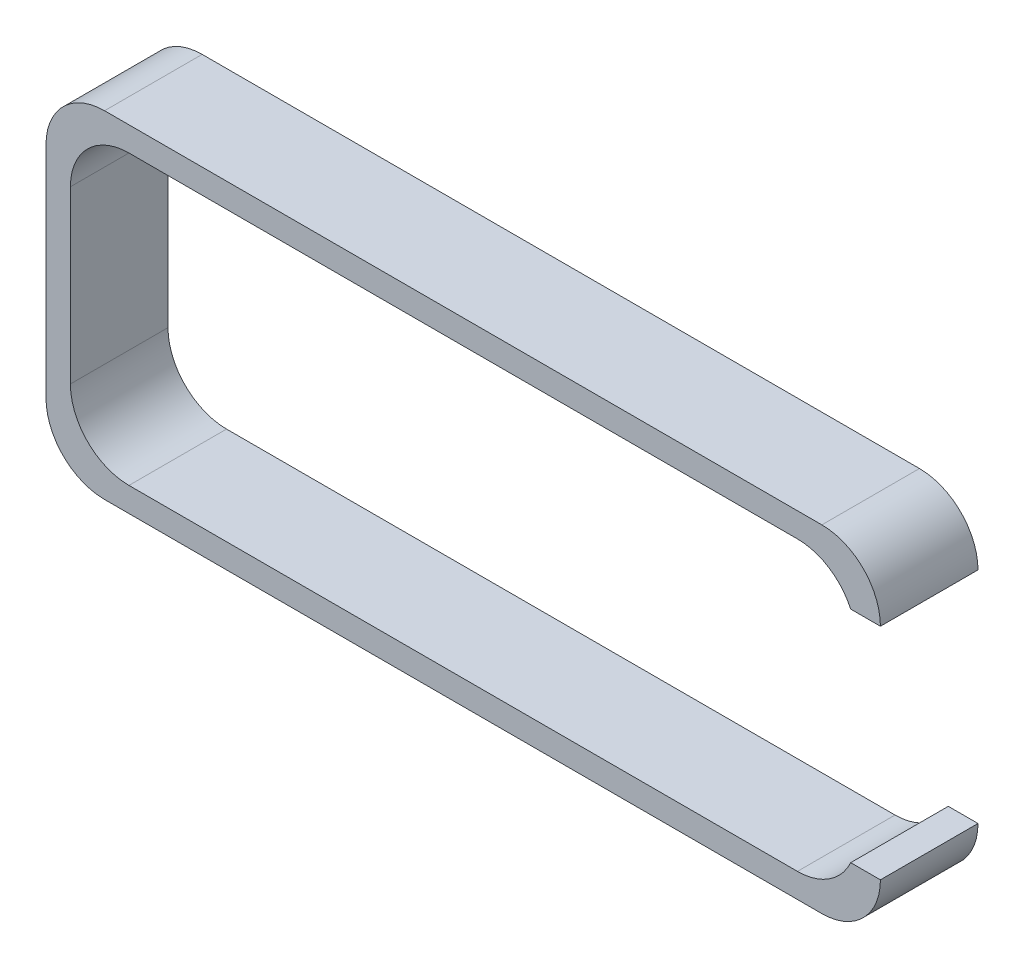
ISO-10303-21;
HEADER;
FILE_DESCRIPTION(('STEP AP214'),'2;1');
FILE_NAME('part.step','',(''),(''),'','','');
FILE_SCHEMA(('AUTOMOTIVE_DESIGN { 1 0 10303 214 1 1 1 1 }'));
ENDSEC;
DATA;
#1=APPLICATION_CONTEXT('core data for automotive mechanical design processes');
#2=APPLICATION_PROTOCOL_DEFINITION('international standard','automotive_design',2000,#1);
#3=PRODUCT_CONTEXT('',#1,'mechanical');
#4=PRODUCT('Part','Part','',(#3));
#5=PRODUCT_RELATED_PRODUCT_CATEGORY('part','',(#4));
#6=PRODUCT_DEFINITION_FORMATION('','',#4);
#7=PRODUCT_DEFINITION_CONTEXT('part definition',#1,'design');
#8=PRODUCT_DEFINITION('design','',#6,#7);
#9=PRODUCT_DEFINITION_SHAPE('','',#8);
#10=(LENGTH_UNIT() NAMED_UNIT(*) SI_UNIT(.MILLI.,.METRE.));
#11=(NAMED_UNIT(*) PLANE_ANGLE_UNIT() SI_UNIT($,.RADIAN.));
#12=(NAMED_UNIT(*) SI_UNIT($,.STERADIAN.) SOLID_ANGLE_UNIT());
#13=UNCERTAINTY_MEASURE_WITH_UNIT(LENGTH_MEASURE(1.E-05),#10,'distance_accuracy_value','');
#14=(GEOMETRIC_REPRESENTATION_CONTEXT(3) GLOBAL_UNCERTAINTY_ASSIGNED_CONTEXT((#13)) GLOBAL_UNIT_ASSIGNED_CONTEXT((#10,
#11,#12)) REPRESENTATION_CONTEXT('',''));
#15=CARTESIAN_POINT('',(0.,0.,0.));
#16=DIRECTION('',(0.,0.,1.));
#17=DIRECTION('',(1.,0.,0.));
#18=AXIS2_PLACEMENT_3D('',#15,#16,#17);
#19=CARTESIAN_POINT('',(-2.50000000000003,32.,10.));
#20=DIRECTION('',(0.,0.,-1.));
#21=DIRECTION('',(-1.,0.,0.));
#22=AXIS2_PLACEMENT_3D('',#19,#20,#21);
#23=PLANE('',#22);
#24=CARTESIAN_POINT('',(77.,3.5,10.));
#25=DIRECTION('',(0.,0.,-1.));
#26=DIRECTION('',(-1.,0.,0.));
#27=AXIS2_PLACEMENT_3D('',#24,#25,#26);
#28=CIRCLE('',#27,6.);
#29=CARTESIAN_POINT('',(77.,-2.5,10.));
#30=VERTEX_POINT('',#29);
#31=CARTESIAN_POINT('',(83.,3.5,10.));
#32=VERTEX_POINT('',#31);
#33=EDGE_CURVE('E174',#30,#32,#28,.F.);
#34=ORIENTED_EDGE('',*,*,#33,.T.);
#35=DIRECTION('',(1.,0.,0.));
#36=VECTOR('',#35,1.);
#37=CARTESIAN_POINT('',(73.,3.5,10.));
#38=LINE('',#37,#36);
#39=CARTESIAN_POINT('',(79.9543560573178,3.5,10.));
#40=VERTEX_POINT('',#39);
#41=EDGE_CURVE('E167',#40,#32,#38,.T.);
#42=ORIENTED_EDGE('',*,*,#41,.F.);
#43=CARTESIAN_POINT('',(74.5,6.,10.));
#44=DIRECTION('',(0.,0.,-1.));
#45=DIRECTION('',(-1.,0.,0.));
#46=AXIS2_PLACEMENT_3D('',#43,#44,#45);
#47=CIRCLE('',#46,6.);
#48=CARTESIAN_POINT('',(74.5,0.,10.));
#49=VERTEX_POINT('',#48);
#50=EDGE_CURVE('E232',#40,#49,#47,.T.);
#51=ORIENTED_EDGE('',*,*,#50,.T.);
#52=DIRECTION('',(1.,0.,0.));
#53=VECTOR('',#52,1.);
#54=CARTESIAN_POINT('',(0.,0.,10.));
#55=LINE('',#54,#53);
#56=CARTESIAN_POINT('',(6.,0.,10.));
#57=VERTEX_POINT('',#56);
#58=EDGE_CURVE('E207',#57,#49,#55,.T.);
#59=ORIENTED_EDGE('',*,*,#58,.F.);
#60=CARTESIAN_POINT('',(6.,6.,10.));
#61=DIRECTION('',(0.,0.,-1.));
#62=DIRECTION('',(-1.,0.,0.));
#63=AXIS2_PLACEMENT_3D('',#60,#61,#62);
#64=CIRCLE('',#63,6.);
#65=CARTESIAN_POINT('',(0.,6.,10.));
#66=VERTEX_POINT('',#65);
#67=EDGE_CURVE('E239',#57,#66,#64,.T.);
#68=ORIENTED_EDGE('',*,*,#67,.T.);
#69=DIRECTION('',(0.,-1.,0.));
#70=VECTOR('',#69,1.);
#71=CARTESIAN_POINT('',(0.,0.,10.));
#72=LINE('',#71,#70);
#73=CARTESIAN_POINT('',(0.,23.5,10.));
#74=VERTEX_POINT('',#73);
#75=EDGE_CURVE('E273',#74,#66,#72,.T.);
#76=ORIENTED_EDGE('',*,*,#75,.F.);
#77=CARTESIAN_POINT('',(5.99999999999999,23.5,10.));
#78=DIRECTION('',(0.,0.,-1.));
#79=DIRECTION('',(-1.,0.,0.));
#80=AXIS2_PLACEMENT_3D('',#77,#78,#79);
#81=CIRCLE('',#80,6.);
#82=CARTESIAN_POINT('',(5.99999999999999,29.5,10.));
#83=VERTEX_POINT('',#82);
#84=EDGE_CURVE('E243',#74,#83,#81,.T.);
#85=ORIENTED_EDGE('',*,*,#84,.T.);
#86=DIRECTION('',(-1.,0.,0.));
#87=VECTOR('',#86,1.);
#88=CARTESIAN_POINT('',(0.,29.5,10.));
#89=LINE('',#88,#87);
#90=CARTESIAN_POINT('',(74.5,29.5,10.));
#91=VERTEX_POINT('',#90);
#92=EDGE_CURVE('E202',#91,#83,#89,.T.);
#93=ORIENTED_EDGE('',*,*,#92,.F.);
#94=CARTESIAN_POINT('',(74.5,23.5,10.));
#95=DIRECTION('',(0.,0.,-1.));
#96=DIRECTION('',(-1.,0.,0.));
#97=AXIS2_PLACEMENT_3D('',#94,#95,#96);
#98=CIRCLE('',#97,6.);
#99=CARTESIAN_POINT('',(79.9543560573178,26.,10.));
#100=VERTEX_POINT('',#99);
#101=EDGE_CURVE('E166',#91,#100,#98,.T.);
#102=ORIENTED_EDGE('',*,*,#101,.T.);
#103=DIRECTION('',(1.,0.,0.));
#104=VECTOR('',#103,1.);
#105=CARTESIAN_POINT('',(73.,26.,10.));
#106=LINE('',#105,#104);
#107=CARTESIAN_POINT('',(83.,26.,10.));
#108=VERTEX_POINT('',#107);
#109=EDGE_CURVE('E149',#100,#108,#106,.T.);
#110=ORIENTED_EDGE('',*,*,#109,.T.);
#111=CARTESIAN_POINT('',(77.,26.,10.));
#112=DIRECTION('',(0.,0.,-1.));
#113=DIRECTION('',(-1.,0.,0.));
#114=AXIS2_PLACEMENT_3D('',#111,#112,#113);
#115=CIRCLE('',#114,6.);
#116=CARTESIAN_POINT('',(77.,32.,10.));
#117=VERTEX_POINT('',#116);
#118=EDGE_CURVE('E162',#108,#117,#115,.F.);
#119=ORIENTED_EDGE('',*,*,#118,.T.);
#120=DIRECTION('',(-1.,0.,0.));
#121=VECTOR('',#120,1.);
#122=CARTESIAN_POINT('',(-2.50000000000003,32.,10.));
#123=LINE('',#122,#121);
#124=CARTESIAN_POINT('',(3.49999999999997,32.,10.));
#125=VERTEX_POINT('',#124);
#126=EDGE_CURVE('E210',#117,#125,#123,.T.);
#127=ORIENTED_EDGE('',*,*,#126,.T.);
#128=CARTESIAN_POINT('',(3.49999999999997,26.,10.));
#129=DIRECTION('',(0.,0.,-1.));
#130=DIRECTION('',(-1.,0.,0.));
#131=AXIS2_PLACEMENT_3D('',#128,#129,#130);
#132=CIRCLE('',#131,6.);
#133=CARTESIAN_POINT('',(-2.50000000000003,26.,10.));
#134=VERTEX_POINT('',#133);
#135=EDGE_CURVE('E156',#125,#134,#132,.F.);
#136=ORIENTED_EDGE('',*,*,#135,.T.);
#137=DIRECTION('',(0.,-1.,0.));
#138=VECTOR('',#137,1.);
#139=CARTESIAN_POINT('',(-2.50000000000003,-2.5,10.));
#140=LINE('',#139,#138);
#141=CARTESIAN_POINT('',(-2.50000000000003,3.5,10.));
#142=VERTEX_POINT('',#141);
#143=EDGE_CURVE('E190',#134,#142,#140,.T.);
#144=ORIENTED_EDGE('',*,*,#143,.T.);
#145=CARTESIAN_POINT('',(3.49999999999997,3.5,10.));
#146=DIRECTION('',(0.,0.,-1.));
#147=DIRECTION('',(-1.,0.,0.));
#148=AXIS2_PLACEMENT_3D('',#145,#146,#147);
#149=CIRCLE('',#148,6.);
#150=CARTESIAN_POINT('',(3.49999999999997,-2.5,10.));
#151=VERTEX_POINT('',#150);
#152=EDGE_CURVE('E55',#142,#151,#149,.F.);
#153=ORIENTED_EDGE('',*,*,#152,.T.);
#154=DIRECTION('',(1.,0.,0.));
#155=VECTOR('',#154,1.);
#156=CARTESIAN_POINT('',(-2.50000000000003,-2.5,10.));
#157=LINE('',#156,#155);
#158=EDGE_CURVE('E287',#151,#30,#157,.T.);
#159=ORIENTED_EDGE('',*,*,#158,.T.);
#160=EDGE_LOOP('',(#34,#42,#51,#59,#68,#76,#85,#93,#102,#110,#119,#127,#136,#144,#153,#159));
#161=FACE_BOUND('',#160,.T.);
#162=ADVANCED_FACE('F33',(#161),#23,.F.);
#163=CARTESIAN_POINT('',(-2.50000000000003,32.,0.));
#164=DIRECTION('',(0.,0.,-1.));
#165=DIRECTION('',(-1.,0.,0.));
#166=AXIS2_PLACEMENT_3D('',#163,#164,#165);
#167=PLANE('',#166);
#168=DIRECTION('',(1.,0.,0.));
#169=VECTOR('',#168,1.);
#170=CARTESIAN_POINT('',(73.,3.5,0.));
#171=LINE('',#170,#169);
#172=CARTESIAN_POINT('',(79.9543560573178,3.5,0.));
#173=VERTEX_POINT('',#172);
#174=CARTESIAN_POINT('',(83.,3.5,0.));
#175=VERTEX_POINT('',#174);
#176=EDGE_CURVE('E297',#173,#175,#171,.T.);
#177=ORIENTED_EDGE('',*,*,#176,.T.);
#178=CARTESIAN_POINT('',(77.,3.5,0.));
#179=DIRECTION('',(0.,0.,-1.));
#180=DIRECTION('',(-1.,0.,0.));
#181=AXIS2_PLACEMENT_3D('',#178,#179,#180);
#182=CIRCLE('',#181,6.);
#183=CARTESIAN_POINT('',(77.,-2.5,0.));
#184=VERTEX_POINT('',#183);
#185=EDGE_CURVE('E250',#175,#184,#182,.T.);
#186=ORIENTED_EDGE('',*,*,#185,.T.);
#187=DIRECTION('',(1.,0.,0.));
#188=VECTOR('',#187,1.);
#189=CARTESIAN_POINT('',(-2.50000000000003,-2.5,0.));
#190=LINE('',#189,#188);
#191=CARTESIAN_POINT('',(3.49999999999997,-2.5,0.));
#192=VERTEX_POINT('',#191);
#193=EDGE_CURVE('E201',#192,#184,#190,.T.);
#194=ORIENTED_EDGE('',*,*,#193,.F.);
#195=CARTESIAN_POINT('',(3.49999999999997,3.5,0.));
#196=DIRECTION('',(0.,0.,-1.));
#197=DIRECTION('',(-1.,0.,0.));
#198=AXIS2_PLACEMENT_3D('',#195,#196,#197);
#199=CIRCLE('',#198,6.);
#200=CARTESIAN_POINT('',(-2.50000000000003,3.5,0.));
#201=VERTEX_POINT('',#200);
#202=EDGE_CURVE('E200',#192,#201,#199,.T.);
#203=ORIENTED_EDGE('',*,*,#202,.T.);
#204=DIRECTION('',(0.,-1.,0.));
#205=VECTOR('',#204,1.);
#206=CARTESIAN_POINT('',(-2.50000000000003,-2.5,0.));
#207=LINE('',#206,#205);
#208=CARTESIAN_POINT('',(-2.50000000000003,26.,0.));
#209=VERTEX_POINT('',#208);
#210=EDGE_CURVE('E188',#209,#201,#207,.T.);
#211=ORIENTED_EDGE('',*,*,#210,.F.);
#212=CARTESIAN_POINT('',(3.49999999999997,26.,0.));
#213=DIRECTION('',(0.,0.,-1.));
#214=DIRECTION('',(-1.,0.,0.));
#215=AXIS2_PLACEMENT_3D('',#212,#213,#214);
#216=CIRCLE('',#215,6.);
#217=CARTESIAN_POINT('',(3.49999999999997,32.,0.));
#218=VERTEX_POINT('',#217);
#219=EDGE_CURVE('E197',#209,#218,#216,.T.);
#220=ORIENTED_EDGE('',*,*,#219,.T.);
#221=DIRECTION('',(-1.,0.,0.));
#222=VECTOR('',#221,1.);
#223=CARTESIAN_POINT('',(-2.50000000000003,32.,0.));
#224=LINE('',#223,#222);
#225=CARTESIAN_POINT('',(77.,32.,0.));
#226=VERTEX_POINT('',#225);
#227=EDGE_CURVE('E204',#226,#218,#224,.T.);
#228=ORIENTED_EDGE('',*,*,#227,.F.);
#229=CARTESIAN_POINT('',(77.,26.,0.));
#230=DIRECTION('',(0.,0.,-1.));
#231=DIRECTION('',(-1.,0.,0.));
#232=AXIS2_PLACEMENT_3D('',#229,#230,#231);
#233=CIRCLE('',#232,6.);
#234=CARTESIAN_POINT('',(83.,26.,0.));
#235=VERTEX_POINT('',#234);
#236=EDGE_CURVE('E252',#226,#235,#233,.T.);
#237=ORIENTED_EDGE('',*,*,#236,.T.);
#238=DIRECTION('',(1.,0.,0.));
#239=VECTOR('',#238,1.);
#240=CARTESIAN_POINT('',(73.,26.,0.));
#241=LINE('',#240,#239);
#242=CARTESIAN_POINT('',(79.9543560573178,26.,0.));
#243=VERTEX_POINT('',#242);
#244=EDGE_CURVE('E152',#243,#235,#241,.T.);
#245=ORIENTED_EDGE('',*,*,#244,.F.);
#246=CARTESIAN_POINT('',(74.5,23.5,0.));
#247=DIRECTION('',(0.,0.,-1.));
#248=DIRECTION('',(-1.,0.,0.));
#249=AXIS2_PLACEMENT_3D('',#246,#247,#248);
#250=CIRCLE('',#249,6.);
#251=CARTESIAN_POINT('',(74.5,29.5,0.));
#252=VERTEX_POINT('',#251);
#253=EDGE_CURVE('E234',#243,#252,#250,.F.);
#254=ORIENTED_EDGE('',*,*,#253,.T.);
#255=DIRECTION('',(-1.,0.,0.));
#256=VECTOR('',#255,1.);
#257=CARTESIAN_POINT('',(0.,29.5,0.));
#258=LINE('',#257,#256);
#259=CARTESIAN_POINT('',(5.99999999999999,29.5,0.));
#260=VERTEX_POINT('',#259);
#261=EDGE_CURVE('E269',#252,#260,#258,.T.);
#262=ORIENTED_EDGE('',*,*,#261,.T.);
#263=CARTESIAN_POINT('',(5.99999999999999,23.5,0.));
#264=DIRECTION('',(0.,0.,-1.));
#265=DIRECTION('',(-1.,0.,0.));
#266=AXIS2_PLACEMENT_3D('',#263,#264,#265);
#267=CIRCLE('',#266,6.);
#268=CARTESIAN_POINT('',(0.,23.5,0.));
#269=VERTEX_POINT('',#268);
#270=EDGE_CURVE('E241',#260,#269,#267,.F.);
#271=ORIENTED_EDGE('',*,*,#270,.T.);
#272=DIRECTION('',(0.,-1.,0.));
#273=VECTOR('',#272,1.);
#274=CARTESIAN_POINT('',(0.,0.,0.));
#275=LINE('',#274,#273);
#276=CARTESIAN_POINT('',(0.,6.,0.));
#277=VERTEX_POINT('',#276);
#278=EDGE_CURVE('E283',#269,#277,#275,.T.);
#279=ORIENTED_EDGE('',*,*,#278,.T.);
#280=CARTESIAN_POINT('',(6.,6.,0.));
#281=DIRECTION('',(0.,0.,-1.));
#282=DIRECTION('',(-1.,0.,0.));
#283=AXIS2_PLACEMENT_3D('',#280,#281,#282);
#284=CIRCLE('',#283,6.);
#285=CARTESIAN_POINT('',(6.,0.,0.));
#286=VERTEX_POINT('',#285);
#287=EDGE_CURVE('E237',#277,#286,#284,.F.);
#288=ORIENTED_EDGE('',*,*,#287,.T.);
#289=DIRECTION('',(1.,0.,0.));
#290=VECTOR('',#289,1.);
#291=CARTESIAN_POINT('',(0.,0.,0.));
#292=LINE('',#291,#290);
#293=CARTESIAN_POINT('',(74.5,0.,0.));
#294=VERTEX_POINT('',#293);
#295=EDGE_CURVE('E279',#286,#294,#292,.T.);
#296=ORIENTED_EDGE('',*,*,#295,.T.);
#297=CARTESIAN_POINT('',(74.5,6.,0.));
#298=DIRECTION('',(0.,0.,-1.));
#299=DIRECTION('',(-1.,0.,0.));
#300=AXIS2_PLACEMENT_3D('',#297,#298,#299);
#301=CIRCLE('',#300,6.);
#302=EDGE_CURVE('E229',#294,#173,#301,.F.);
#303=ORIENTED_EDGE('',*,*,#302,.T.);
#304=EDGE_LOOP('',(#177,#186,#194,#203,#211,#220,#228,#237,#245,#254,#262,#271,#279,#288,#296,#303));
#305=FACE_BOUND('',#304,.T.);
#306=ADVANCED_FACE('F195',(#305),#167,.T.);
#307=CARTESIAN_POINT('',(-2.50000000000003,-2.5,10.));
#308=DIRECTION('',(1.,0.,0.));
#309=DIRECTION('',(0.,0.,-1.));
#310=AXIS2_PLACEMENT_3D('',#307,#308,#309);
#311=PLANE('',#310);
#312=ORIENTED_EDGE('',*,*,#210,.T.);
#313=DIRECTION('',(0.,0.,-1.));
#314=VECTOR('',#313,1.);
#315=CARTESIAN_POINT('',(-2.50000000000003,3.5,10.));
#316=LINE('',#315,#314);
#317=EDGE_CURVE('E11',#201,#142,#316,.F.);
#318=ORIENTED_EDGE('',*,*,#317,.T.);
#319=ORIENTED_EDGE('',*,*,#143,.F.);
#320=DIRECTION('',(0.,0.,-1.));
#321=VECTOR('',#320,1.);
#322=CARTESIAN_POINT('',(-2.50000000000003,26.,10.));
#323=LINE('',#322,#321);
#324=EDGE_CURVE('E41',#134,#209,#323,.T.);
#325=ORIENTED_EDGE('',*,*,#324,.T.);
#326=EDGE_LOOP('',(#312,#318,#319,#325));
#327=FACE_BOUND('',#326,.T.);
#328=ADVANCED_FACE('F187',(#327),#311,.F.);
#329=CARTESIAN_POINT('',(-2.50000000000003,-2.5,10.));
#330=DIRECTION('',(0.,1.,0.));
#331=DIRECTION('',(0.,0.,1.));
#332=AXIS2_PLACEMENT_3D('',#329,#330,#331);
#333=PLANE('',#332);
#334=ORIENTED_EDGE('',*,*,#193,.T.);
#335=DIRECTION('',(0.,0.,-1.));
#336=VECTOR('',#335,1.);
#337=CARTESIAN_POINT('',(77.,-2.5,10.));
#338=LINE('',#337,#336);
#339=EDGE_CURVE('E48',#184,#30,#338,.F.);
#340=ORIENTED_EDGE('',*,*,#339,.T.);
#341=ORIENTED_EDGE('',*,*,#158,.F.);
#342=DIRECTION('',(0.,0.,-1.));
#343=VECTOR('',#342,1.);
#344=CARTESIAN_POINT('',(3.49999999999997,-2.5,10.));
#345=LINE('',#344,#343);
#346=EDGE_CURVE('E173',#151,#192,#345,.T.);
#347=ORIENTED_EDGE('',*,*,#346,.T.);
#348=EDGE_LOOP('',(#334,#340,#341,#347));
#349=FACE_BOUND('',#348,.T.);
#350=ADVANCED_FACE('F341',(#349),#333,.F.);
#351=CARTESIAN_POINT('',(-2.50000000000003,32.,10.));
#352=DIRECTION('',(0.,-1.,0.));
#353=DIRECTION('',(0.,0.,-1.));
#354=AXIS2_PLACEMENT_3D('',#351,#352,#353);
#355=PLANE('',#354);
#356=ORIENTED_EDGE('',*,*,#126,.F.);
#357=DIRECTION('',(0.,0.,-1.));
#358=VECTOR('',#357,1.);
#359=CARTESIAN_POINT('',(77.,32.,10.));
#360=LINE('',#359,#358);
#361=EDGE_CURVE('E172',#117,#226,#360,.T.);
#362=ORIENTED_EDGE('',*,*,#361,.T.);
#363=ORIENTED_EDGE('',*,*,#227,.T.);
#364=DIRECTION('',(0.,0.,-1.));
#365=VECTOR('',#364,1.);
#366=CARTESIAN_POINT('',(3.49999999999997,32.,10.));
#367=LINE('',#366,#365);
#368=EDGE_CURVE('E245',#218,#125,#367,.F.);
#369=ORIENTED_EDGE('',*,*,#368,.T.);
#370=EDGE_LOOP('',(#356,#362,#363,#369));
#371=FACE_BOUND('',#370,.T.);
#372=ADVANCED_FACE('F257',(#371),#355,.F.);
#373=CARTESIAN_POINT('',(0.,0.,10.));
#374=DIRECTION('',(1.,0.,0.));
#375=DIRECTION('',(0.,1.,0.));
#376=AXIS2_PLACEMENT_3D('',#373,#374,#375);
#377=PLANE('',#376);
#378=ORIENTED_EDGE('',*,*,#75,.T.);
#379=DIRECTION('',(0.,0.,-1.));
#380=VECTOR('',#379,1.);
#381=CARTESIAN_POINT('',(0.,6.,0.));
#382=LINE('',#381,#380);
#383=EDGE_CURVE('E226',#66,#277,#382,.T.);
#384=ORIENTED_EDGE('',*,*,#383,.T.);
#385=ORIENTED_EDGE('',*,*,#278,.F.);
#386=DIRECTION('',(0.,0.,-1.));
#387=VECTOR('',#386,1.);
#388=CARTESIAN_POINT('',(0.,23.5,10.));
#389=LINE('',#388,#387);
#390=EDGE_CURVE('E224',#269,#74,#389,.F.);
#391=ORIENTED_EDGE('',*,*,#390,.T.);
#392=EDGE_LOOP('',(#378,#384,#385,#391));
#393=FACE_BOUND('',#392,.T.);
#394=ADVANCED_FACE('F308',(#393),#377,.T.);
#395=CARTESIAN_POINT('',(0.,0.,10.));
#396=DIRECTION('',(0.,1.,0.));
#397=DIRECTION('',(0.,0.,1.));
#398=AXIS2_PLACEMENT_3D('',#395,#396,#397);
#399=PLANE('',#398);
#400=ORIENTED_EDGE('',*,*,#58,.T.);
#401=DIRECTION('',(0.,0.,-1.));
#402=VECTOR('',#401,1.);
#403=CARTESIAN_POINT('',(74.5,0.,0.));
#404=LINE('',#403,#402);
#405=EDGE_CURVE('E216',#49,#294,#404,.T.);
#406=ORIENTED_EDGE('',*,*,#405,.T.);
#407=ORIENTED_EDGE('',*,*,#295,.F.);
#408=DIRECTION('',(0.,0.,-1.));
#409=VECTOR('',#408,1.);
#410=CARTESIAN_POINT('',(6.,0.,10.));
#411=LINE('',#410,#409);
#412=EDGE_CURVE('E214',#286,#57,#411,.F.);
#413=ORIENTED_EDGE('',*,*,#412,.T.);
#414=EDGE_LOOP('',(#400,#406,#407,#413));
#415=FACE_BOUND('',#414,.T.);
#416=ADVANCED_FACE('F316',(#415),#399,.T.);
#417=CARTESIAN_POINT('',(0.,29.5,10.));
#418=DIRECTION('',(0.,-1.,0.));
#419=DIRECTION('',(0.,0.,-1.));
#420=AXIS2_PLACEMENT_3D('',#417,#418,#419);
#421=PLANE('',#420);
#422=ORIENTED_EDGE('',*,*,#261,.F.);
#423=DIRECTION('',(0.,0.,-1.));
#424=VECTOR('',#423,1.);
#425=CARTESIAN_POINT('',(74.5,29.5,10.));
#426=LINE('',#425,#424);
#427=EDGE_CURVE('E222',#252,#91,#426,.F.);
#428=ORIENTED_EDGE('',*,*,#427,.T.);
#429=ORIENTED_EDGE('',*,*,#92,.T.);
#430=DIRECTION('',(0.,0.,-1.));
#431=VECTOR('',#430,1.);
#432=CARTESIAN_POINT('',(5.99999999999999,29.5,0.));
#433=LINE('',#432,#431);
#434=EDGE_CURVE('E219',#83,#260,#433,.T.);
#435=ORIENTED_EDGE('',*,*,#434,.T.);
#436=EDGE_LOOP('',(#422,#428,#429,#435));
#437=FACE_BOUND('',#436,.T.);
#438=ADVANCED_FACE('F267',(#437),#421,.T.);
#439=CARTESIAN_POINT('',(74.5,6.,10.));
#440=DIRECTION('',(0.,0.,1.));
#441=DIRECTION('',(1.,0.,0.));
#442=AXIS2_PLACEMENT_3D('',#439,#440,#441);
#443=CYLINDRICAL_SURFACE('',#442,6.);
#444=ORIENTED_EDGE('',*,*,#50,.F.);
#445=DIRECTION('',(0.,0.,1.));
#446=VECTOR('',#445,1.);
#447=CARTESIAN_POINT('',(79.9543560573178,3.5,10.));
#448=LINE('',#447,#446);
#449=EDGE_CURVE('E299',#40,#173,#448,.F.);
#450=ORIENTED_EDGE('',*,*,#449,.T.);
#451=ORIENTED_EDGE('',*,*,#302,.F.);
#452=ORIENTED_EDGE('',*,*,#405,.F.);
#453=EDGE_LOOP('',(#444,#450,#451,#452));
#454=FACE_BOUND('',#453,.T.);
#455=ADVANCED_FACE('F320',(#454),#443,.F.);
#456=CARTESIAN_POINT('',(74.5,23.5,10.));
#457=DIRECTION('',(0.,0.,1.));
#458=DIRECTION('',(1.,0.,0.));
#459=AXIS2_PLACEMENT_3D('',#456,#457,#458);
#460=CYLINDRICAL_SURFACE('',#459,6.);
#461=ORIENTED_EDGE('',*,*,#253,.F.);
#462=DIRECTION('',(0.,0.,1.));
#463=VECTOR('',#462,1.);
#464=CARTESIAN_POINT('',(79.9543560573178,26.,10.));
#465=LINE('',#464,#463);
#466=EDGE_CURVE('E265',#243,#100,#465,.T.);
#467=ORIENTED_EDGE('',*,*,#466,.T.);
#468=ORIENTED_EDGE('',*,*,#101,.F.);
#469=ORIENTED_EDGE('',*,*,#427,.F.);
#470=EDGE_LOOP('',(#461,#467,#468,#469));
#471=FACE_BOUND('',#470,.T.);
#472=ADVANCED_FACE('F264',(#471),#460,.F.);
#473=CARTESIAN_POINT('',(6.,6.,10.));
#474=DIRECTION('',(0.,0.,1.));
#475=DIRECTION('',(1.,0.,0.));
#476=AXIS2_PLACEMENT_3D('',#473,#474,#475);
#477=CYLINDRICAL_SURFACE('',#476,6.);
#478=ORIENTED_EDGE('',*,*,#67,.F.);
#479=ORIENTED_EDGE('',*,*,#412,.F.);
#480=ORIENTED_EDGE('',*,*,#287,.F.);
#481=ORIENTED_EDGE('',*,*,#383,.F.);
#482=EDGE_LOOP('',(#478,#479,#480,#481));
#483=FACE_BOUND('',#482,.T.);
#484=ADVANCED_FACE('F312',(#483),#477,.F.);
#485=CARTESIAN_POINT('',(5.99999999999999,23.5,10.));
#486=DIRECTION('',(0.,0.,1.));
#487=DIRECTION('',(1.,0.,0.));
#488=AXIS2_PLACEMENT_3D('',#485,#486,#487);
#489=CYLINDRICAL_SURFACE('',#488,6.);
#490=ORIENTED_EDGE('',*,*,#84,.F.);
#491=ORIENTED_EDGE('',*,*,#390,.F.);
#492=ORIENTED_EDGE('',*,*,#270,.F.);
#493=ORIENTED_EDGE('',*,*,#434,.F.);
#494=EDGE_LOOP('',(#490,#491,#492,#493));
#495=FACE_BOUND('',#494,.T.);
#496=ADVANCED_FACE('F276',(#495),#489,.F.);
#497=CARTESIAN_POINT('',(77.,26.,10.));
#498=DIRECTION('',(0.,0.,-1.));
#499=DIRECTION('',(-1.,0.,0.));
#500=AXIS2_PLACEMENT_3D('',#497,#498,#499);
#501=CYLINDRICAL_SURFACE('',#500,6.);
#502=ORIENTED_EDGE('',*,*,#118,.F.);
#503=DIRECTION('',(0.,0.,-1.));
#504=VECTOR('',#503,1.);
#505=CARTESIAN_POINT('',(83.,26.,10.));
#506=LINE('',#505,#504);
#507=EDGE_CURVE('E146',#235,#108,#506,.F.);
#508=ORIENTED_EDGE('',*,*,#507,.F.);
#509=ORIENTED_EDGE('',*,*,#236,.F.);
#510=ORIENTED_EDGE('',*,*,#361,.F.);
#511=EDGE_LOOP('',(#502,#508,#509,#510));
#512=FACE_BOUND('',#511,.T.);
#513=ADVANCED_FACE('F170',(#512),#501,.T.);
#514=CARTESIAN_POINT('',(77.,3.5,10.));
#515=DIRECTION('',(0.,0.,-1.));
#516=DIRECTION('',(-1.,0.,0.));
#517=AXIS2_PLACEMENT_3D('',#514,#515,#516);
#518=CYLINDRICAL_SURFACE('',#517,6.);
#519=ORIENTED_EDGE('',*,*,#33,.F.);
#520=ORIENTED_EDGE('',*,*,#339,.F.);
#521=ORIENTED_EDGE('',*,*,#185,.F.);
#522=DIRECTION('',(0.,0.,-1.));
#523=VECTOR('',#522,1.);
#524=CARTESIAN_POINT('',(83.,3.5,10.));
#525=LINE('',#524,#523);
#526=EDGE_CURVE('E157',#32,#175,#525,.T.);
#527=ORIENTED_EDGE('',*,*,#526,.F.);
#528=EDGE_LOOP('',(#519,#520,#521,#527));
#529=FACE_BOUND('',#528,.T.);
#530=ADVANCED_FACE('F293',(#529),#518,.T.);
#531=CARTESIAN_POINT('',(3.49999999999997,3.5,10.));
#532=DIRECTION('',(0.,0.,-1.));
#533=DIRECTION('',(-1.,0.,0.));
#534=AXIS2_PLACEMENT_3D('',#531,#532,#533);
#535=CYLINDRICAL_SURFACE('',#534,6.);
#536=ORIENTED_EDGE('',*,*,#152,.F.);
#537=ORIENTED_EDGE('',*,*,#317,.F.);
#538=ORIENTED_EDGE('',*,*,#202,.F.);
#539=ORIENTED_EDGE('',*,*,#346,.F.);
#540=EDGE_LOOP('',(#536,#537,#538,#539));
#541=FACE_BOUND('',#540,.T.);
#542=ADVANCED_FACE('F404',(#541),#535,.T.);
#543=CARTESIAN_POINT('',(3.49999999999997,26.,10.));
#544=DIRECTION('',(0.,0.,-1.));
#545=DIRECTION('',(-1.,0.,0.));
#546=AXIS2_PLACEMENT_3D('',#543,#544,#545);
#547=CYLINDRICAL_SURFACE('',#546,6.);
#548=ORIENTED_EDGE('',*,*,#135,.F.);
#549=ORIENTED_EDGE('',*,*,#368,.F.);
#550=ORIENTED_EDGE('',*,*,#219,.F.);
#551=ORIENTED_EDGE('',*,*,#324,.F.);
#552=EDGE_LOOP('',(#548,#549,#550,#551));
#553=FACE_BOUND('',#552,.T.);
#554=ADVANCED_FACE('F35',(#553),#547,.T.);
#555=CARTESIAN_POINT('',(73.,3.5,0.));
#556=DIRECTION('',(0.,-1.,0.));
#557=DIRECTION('',(0.,0.,-1.));
#558=AXIS2_PLACEMENT_3D('',#555,#556,#557);
#559=PLANE('',#558);
#560=ORIENTED_EDGE('',*,*,#41,.T.);
#561=ORIENTED_EDGE('',*,*,#526,.T.);
#562=ORIENTED_EDGE('',*,*,#176,.F.);
#563=ORIENTED_EDGE('',*,*,#449,.F.);
#564=EDGE_LOOP('',(#560,#561,#562,#563));
#565=FACE_BOUND('',#564,.T.);
#566=ADVANCED_FACE('F296',(#565),#559,.F.);
#567=CARTESIAN_POINT('',(73.,26.,0.));
#568=DIRECTION('',(0.,1.,0.));
#569=DIRECTION('',(0.,0.,1.));
#570=AXIS2_PLACEMENT_3D('',#567,#568,#569);
#571=PLANE('',#570);
#572=ORIENTED_EDGE('',*,*,#244,.T.);
#573=ORIENTED_EDGE('',*,*,#507,.T.);
#574=ORIENTED_EDGE('',*,*,#109,.F.);
#575=ORIENTED_EDGE('',*,*,#466,.F.);
#576=EDGE_LOOP('',(#572,#573,#574,#575));
#577=FACE_BOUND('',#576,.T.);
#578=ADVANCED_FACE('F148',(#577),#571,.F.);
#579=CLOSED_SHELL('',(#162,#306,#328,#350,#372,#394,#416,#438,#455,#472,#484,#496,#513,#530,
#542,#554,#566,#578));
#580=MANIFOLD_SOLID_BREP('B2',#579);
#581=ADVANCED_BREP_SHAPE_REPRESENTATION('',(#18,#580),#14);
#582=SHAPE_DEFINITION_REPRESENTATION(#9,#581);
ENDSEC;
END-ISO-10303-21;
